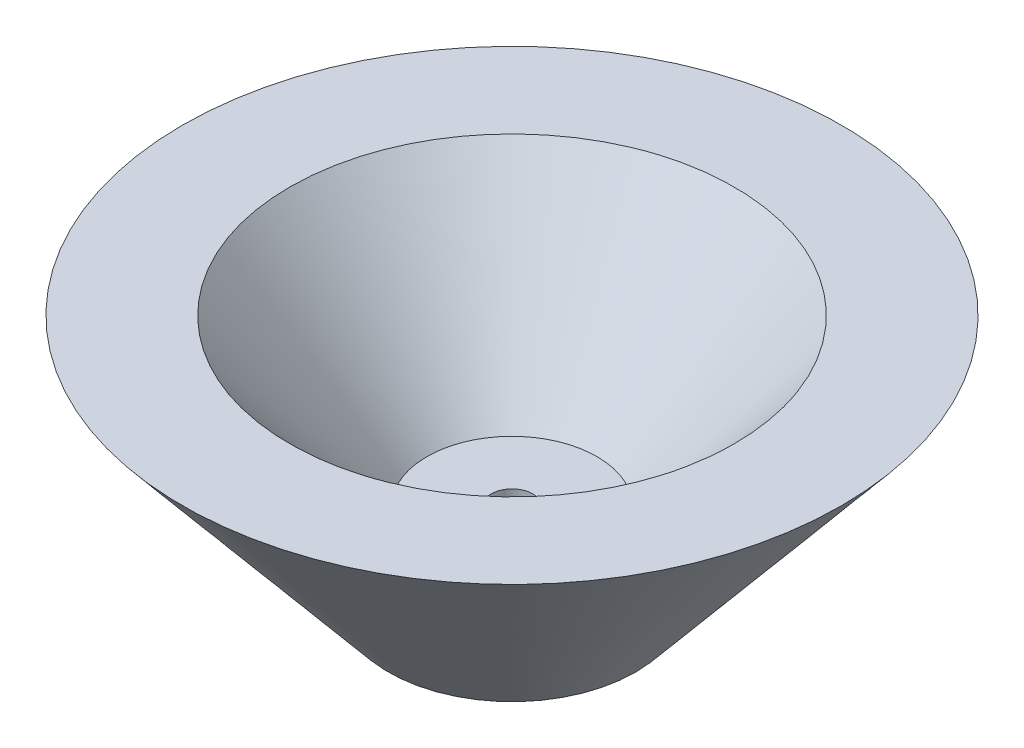
ISO-10303-21;
HEADER;
FILE_DESCRIPTION(('STEP AP214'),'2;1');
FILE_NAME('part.step','',(''),(''),'','','');
FILE_SCHEMA(('AUTOMOTIVE_DESIGN { 1 0 10303 214 1 1 1 1 }'));
ENDSEC;
DATA;
#1=APPLICATION_CONTEXT('core data for automotive mechanical design processes');
#2=APPLICATION_PROTOCOL_DEFINITION('international standard','automotive_design',2000,#1);
#3=PRODUCT_CONTEXT('',#1,'mechanical');
#4=PRODUCT('Part','Part','',(#3));
#5=PRODUCT_RELATED_PRODUCT_CATEGORY('part','',(#4));
#6=PRODUCT_DEFINITION_FORMATION('','',#4);
#7=PRODUCT_DEFINITION_CONTEXT('part definition',#1,'design');
#8=PRODUCT_DEFINITION('design','',#6,#7);
#9=PRODUCT_DEFINITION_SHAPE('','',#8);
#10=(LENGTH_UNIT() NAMED_UNIT(*) SI_UNIT(.MILLI.,.METRE.));
#11=(NAMED_UNIT(*) PLANE_ANGLE_UNIT() SI_UNIT($,.RADIAN.));
#12=(NAMED_UNIT(*) SI_UNIT($,.STERADIAN.) SOLID_ANGLE_UNIT());
#13=UNCERTAINTY_MEASURE_WITH_UNIT(LENGTH_MEASURE(1.E-05),#10,'distance_accuracy_value','');
#14=(GEOMETRIC_REPRESENTATION_CONTEXT(3) GLOBAL_UNCERTAINTY_ASSIGNED_CONTEXT((#13)) GLOBAL_UNIT_ASSIGNED_CONTEXT((#10,
#11,#12)) REPRESENTATION_CONTEXT('',''));
#15=CARTESIAN_POINT('',(0.,0.,0.));
#16=DIRECTION('',(0.,0.,1.));
#17=DIRECTION('',(1.,0.,0.));
#18=AXIS2_PLACEMENT_3D('',#15,#16,#17);
#19=CARTESIAN_POINT('',(0.,0.,0.));
#20=DIRECTION('',(0.,1.,0.));
#21=DIRECTION('',(0.,0.,1.));
#22=AXIS2_PLACEMENT_3D('',#19,#20,#21);
#23=PLANE('',#22);
#24=CARTESIAN_POINT('',(0.,0.,0.));
#25=DIRECTION('',(0.,1.,0.));
#26=DIRECTION('',(0.,0.,1.));
#27=AXIS2_PLACEMENT_3D('',#24,#25,#26);
#28=CIRCLE('',#27,2.5);
#29=CARTESIAN_POINT('',(0.,0.,2.5));
#30=VERTEX_POINT('',#29);
#31=EDGE_CURVE('E154',#30,#30,#28,.T.);
#32=ORIENTED_EDGE('',*,*,#31,.T.);
#33=EDGE_LOOP('',(#32));
#34=FACE_BOUND('',#33,.T.);
#35=CARTESIAN_POINT('',(0.,0.,0.));
#36=DIRECTION('',(0.,1.,0.));
#37=DIRECTION('',(0.,0.,1.));
#38=AXIS2_PLACEMENT_3D('',#35,#36,#37);
#39=CIRCLE('',#38,15.);
#40=CARTESIAN_POINT('',(15.,0.,0.));
#41=VERTEX_POINT('',#40);
#42=EDGE_CURVE('E12',#41,#41,#39,.T.);
#43=ORIENTED_EDGE('',*,*,#42,.F.);
#44=EDGE_LOOP('',(#43));
#45=FACE_BOUND('',#44,.T.);
#46=ADVANCED_FACE('F59',(#34,#45),#23,.F.);
#47=CARTESIAN_POINT('',(0.,30.,0.));
#48=DIRECTION('',(0.,1.,0.));
#49=DIRECTION('',(0.,0.,1.));
#50=AXIS2_PLACEMENT_3D('',#47,#48,#49);
#51=PLANE('',#50);
#52=CARTESIAN_POINT('',(0.,30.,-26.9829172068223));
#53=CARTESIAN_POINT('',(-0.780398825909655,30.,-26.9829223492156));
#54=CARTESIAN_POINT('',(-1.56073973750513,30.,-26.9498586144388));
#55=CARTESIAN_POINT('',(-3.11593630014212,30.,-26.8165341658903));
#56=CARTESIAN_POINT('',(-3.89079048214834,30.,-26.716256095873));
#57=CARTESIAN_POINT('',(-5.42945701852632,30.,-26.4483598528932));
#58=CARTESIAN_POINT('',(-6.19325932773842,30.,-26.2806839713188));
#59=CARTESIAN_POINT('',(-7.70316741900822,30.,-25.8790008176145));
#60=CARTESIAN_POINT('',(-8.44927458037557,30.,-25.6449987340477));
#61=CARTESIAN_POINT('',(-9.89595977565913,30.,-25.1205509906791));
#62=CARTESIAN_POINT('',(-10.5972322717818,30.,-24.832018195185));
#63=CARTESIAN_POINT('',(-11.9728305858836,30.,-24.1966234706895));
#64=CARTESIAN_POINT('',(-12.6471564626082,30.,-23.849761668858));
#65=CARTESIAN_POINT('',(-13.9641952149002,30.,-23.1004884164148));
#66=CARTESIAN_POINT('',(-14.606907985689,30.,-22.6980767817056));
#67=CARTESIAN_POINT('',(-15.8563564055711,30.,-21.8408230590299));
#68=CARTESIAN_POINT('',(-16.4630918539285,30.,-21.3859806785673));
#69=CARTESIAN_POINT('',(-17.6363984420286,30.,-20.4273103324598));
#70=CARTESIAN_POINT('',(-18.2029750330901,30.,-19.9234890375067));
#71=CARTESIAN_POINT('',(-19.2921825998457,30.,-18.8703963847273));
#72=CARTESIAN_POINT('',(-19.8148136270073,30.,-18.3211250801318));
#73=CARTESIAN_POINT('',(-20.8124080498688,30.,-17.1809821258604));
#74=CARTESIAN_POINT('',(-21.2873767748719,30.,-16.5901151397546));
#75=CARTESIAN_POINT('',(-22.1862488674157,30.,-15.3707312058554));
#76=CARTESIAN_POINT('',(-22.610152195603,30.,-14.7422142290475));
#77=CARTESIAN_POINT('',(-23.4074145378233,30.,-13.4456797932758));
#78=CARTESIAN_POINT('',(-23.7802582633012,30.,-12.7773452823593));
#79=CARTESIAN_POINT('',(-24.4676112262846,30.,-11.4113053874127));
#80=CARTESIAN_POINT('',(-24.7821196830254,30.,-10.7135996104281));
#81=CARTESIAN_POINT('',(-25.350212361059,30.,-9.29380153236564));
#82=CARTESIAN_POINT('',(-25.603796986774,30.,-8.57170939320472));
#83=CARTESIAN_POINT('',(-26.0480214683453,30.,-7.10847739021179));
#84=CARTESIAN_POINT('',(-26.2386642989231,30.,-6.36733842834536));
#85=CARTESIAN_POINT('',(-26.5533243333435,30.,-4.88280039534374));
#86=CARTESIAN_POINT('',(-26.6783151794666,30.,-4.13960894519706));
#87=CARTESIAN_POINT('',(-26.8188114957262,30.,-3.01912233076053));
#88=CARTESIAN_POINT('',(-26.8578140311056,30.,-2.64462601791168));
#89=CARTESIAN_POINT('',(-26.9202104229966,30.,-1.89430884850001));
#90=CARTESIAN_POINT('',(-26.9436041811845,30.,-1.51848798360849));
#91=CARTESIAN_POINT('',(-26.9748671166619,30.,-0.766164810972904));
#92=CARTESIAN_POINT('',(-26.9827344263657,30.,-0.389662426703873));
#93=CARTESIAN_POINT('',(-26.9830937303915,30.,0.363349268597036));
#94=CARTESIAN_POINT('',(-26.975585736453,30.,0.739858579623406));
#95=CARTESIAN_POINT('',(-26.9450438256533,30.,1.49224661949661));
#96=CARTESIAN_POINT('',(-26.9220103061162,30.,1.86812536423391));
#97=CARTESIAN_POINT('',(-26.860332872793,30.,2.61857364184882));
#98=CARTESIAN_POINT('',(-26.8216890014141,30.,2.99314317828024));
#99=CARTESIAN_POINT('',(-26.680877040275,30.,4.12501310864206));
#100=CARTESIAN_POINT('',(-26.5542644459797,30.,4.87943213859526));
#101=CARTESIAN_POINT('',(-26.2369042093327,30.,6.37456379148723));
#102=CARTESIAN_POINT('',(-26.0461560965451,30.,7.11527631384632));
#103=CARTESIAN_POINT('',(-25.6018647020952,30.,8.57741410689666));
#104=CARTESIAN_POINT('',(-25.3483397689536,30.,9.29884494513058));
#105=CARTESIAN_POINT('',(-24.7804729866827,30.,10.7173494268769));
#106=CARTESIAN_POINT('',(-24.466131031462,30.,11.4144230278972));
#107=CARTESIAN_POINT('',(-23.7845393107343,30.,12.7686633254565));
#108=CARTESIAN_POINT('',(-23.4181850609602,30.,13.4262810848909));
#109=CARTESIAN_POINT('',(-22.6318996097265,30.,14.7086464622493));
#110=CARTESIAN_POINT('',(-22.2119691069044,30.,15.3333945086462));
#111=CARTESIAN_POINT('',(-21.3215257880208,30.,16.5460765387337));
#112=CARTESIAN_POINT('',(-20.8509948292352,30.,17.1339971976475));
#113=CARTESIAN_POINT('',(-19.8628582407092,30.,18.2688579517712));
#114=CARTESIAN_POINT('',(-19.34525186935,30.,18.8157974011216));
#115=CARTESIAN_POINT('',(-18.25951171441,30.,19.871819978317));
#116=CARTESIAN_POINT('',(-17.6908068504556,30.,20.3803161510284));
#117=CARTESIAN_POINT('',(-16.5127064983646,30.,21.3477666652937));
#118=CARTESIAN_POINT('',(-15.9033108504236,30.,21.8067208122633));
#119=CARTESIAN_POINT('',(-14.6482292031252,30.,22.6714840992252));
#120=CARTESIAN_POINT('',(-14.0025565193601,30.,23.0773125593641));
#121=CARTESIAN_POINT('',(-12.6791551335234,30.,23.8328391391438));
#122=CARTESIAN_POINT('',(-12.0014264581868,30.,24.1825373055968));
#123=CARTESIAN_POINT('',(-10.6190935406679,30.,24.8227662427522));
#124=CARTESIAN_POINT('',(-9.91450670956436,30.,25.1133345957822));
#125=CARTESIAN_POINT('',(-8.48309328021703,30.,25.6332213272784));
#126=CARTESIAN_POINT('',(-7.7562672053061,30.,25.8625411458086));
#127=CARTESIAN_POINT('',(-6.28546771643838,30.,26.2582680471186));
#128=CARTESIAN_POINT('',(-5.541488928969,30.,26.424655122536));
#129=CARTESIAN_POINT('',(-4.04195345102691,30.,26.6934562597026));
#130=CARTESIAN_POINT('',(-3.28639646802886,30.,26.7958687023811));
#131=CARTESIAN_POINT('',(-2.15337045524962,30.,26.9010404468998));
#132=CARTESIAN_POINT('',(-1.77799197102523,30.,26.9280034466844));
#133=CARTESIAN_POINT('',(-1.02641654335677,30.,26.9663935996167));
#134=CARTESIAN_POINT('',(-0.650219593897431,30.,26.9778206381946));
#135=CARTESIAN_POINT('',(0.102325530953517,30.,26.9852985936104));
#136=CARTESIAN_POINT('',(0.478673706149953,30.,26.9813495302291));
#137=CARTESIAN_POINT('',(1.23086575153609,30.,26.9579948875457));
#138=CARTESIAN_POINT('',(1.60670962546063,30.,26.9385894233532));
#139=CARTESIAN_POINT('',(2.73238217019635,30.,26.8569849981424));
#140=CARTESIAN_POINT('',(3.48066332418591,30.,26.7714013055645));
#141=CARTESIAN_POINT('',(4.96728288879418,30.,26.5377104357115));
#142=CARTESIAN_POINT('',(5.70562166953427,30.,26.3896055925671));
#143=CARTESIAN_POINT('',(7.17784665581685,30.,26.028968420202));
#144=CARTESIAN_POINT('',(7.9115112354395,30.,25.8155287911601));
#145=CARTESIAN_POINT('',(9.35787257315449,30.,25.3265642705419));
#146=CARTESIAN_POINT('',(10.0705684186308,30.,25.0510366812354));
#147=CARTESIAN_POINT('',(11.4698856532878,30.,24.4400994393295));
#148=CARTESIAN_POINT('',(12.1565046280889,30.,24.1046842582291));
#149=CARTESIAN_POINT('',(13.4987415441763,30.,23.3767335431929));
#150=CARTESIAN_POINT('',(14.15435995055,30.,22.9841988665557));
#151=CARTESIAN_POINT('',(15.4217915347714,30.,22.1505717563509));
#152=CARTESIAN_POINT('',(16.0340623677882,30.,21.7101746893976));
#153=CARTESIAN_POINT('',(17.2198939291106,30.,20.7800421958399));
#154=CARTESIAN_POINT('',(17.7934549088222,30.,20.2903070897189));
#155=CARTESIAN_POINT('',(18.8980704140634,30.,19.2649200210071));
#156=CARTESIAN_POINT('',(19.4291199972862,30.,18.7292627345255));
#157=CARTESIAN_POINT('',(20.4449836347146,30.,17.6157566515675));
#158=CARTESIAN_POINT('',(20.9297971907813,30.,17.0379074006406));
#159=CARTESIAN_POINT('',(21.8565814104182,30.,15.8350003308145));
#160=CARTESIAN_POINT('',(22.2978059222353,30.,15.2093673092391));
#161=CARTESIAN_POINT('',(23.1256675901596,30.,13.9229553064759));
#162=CARTESIAN_POINT('',(23.5123042493958,30.,13.262176005454));
#163=CARTESIAN_POINT('',(24.2277792839944,30.,11.910283944266));
#164=CARTESIAN_POINT('',(24.5566353235987,30.,11.2191805355779));
#165=CARTESIAN_POINT('',(25.1539898968212,30.,9.81135958929592));
#166=CARTESIAN_POINT('',(25.422489527588,30.,9.09464251757736));
#167=CARTESIAN_POINT('',(25.8944838946303,30.,7.64845857473161));
#168=CARTESIAN_POINT('',(26.0986305179277,30.,6.91920409736418));
#169=CARTESIAN_POINT('',(26.4442914831349,30.,5.44591501718862));
#170=CARTESIAN_POINT('',(26.5858070671097,30.,4.70188070779193));
#171=CARTESIAN_POINT('',(26.7506475340682,30.,3.57894370747151));
#172=CARTESIAN_POINT('',(26.7976957731823,30.,3.2033715340538));
#173=CARTESIAN_POINT('',(26.8759963494079,30.,2.4505587735606));
#174=CARTESIAN_POINT('',(26.9072486738124,30.,2.07331818514319));
#175=CARTESIAN_POINT('',(26.9540039537179,30.,1.31784877461247));
#176=CARTESIAN_POINT('',(26.9695059800106,30.,0.939619895513321));
#177=CARTESIAN_POINT('',(26.9849207569893,30.,0.182843975350685));
#178=CARTESIAN_POINT('',(26.9848334052,30.,-0.195703067787864));
#179=CARTESIAN_POINT('',(26.9690395770501,30.,-0.953652637047121));
#180=CARTESIAN_POINT('',(26.953284732682,30.,-1.33305418214078));
#181=CARTESIAN_POINT('',(26.9059324227233,30.,-2.09083981969276));
#182=CARTESIAN_POINT('',(26.874335091682,30.,-2.46922392076474));
#183=CARTESIAN_POINT('',(26.7556718565393,30.,-3.60180647044037));
#184=CARTESIAN_POINT('',(26.6447302423316,30.,-4.35365587196606));
#185=CARTESIAN_POINT('',(26.3594235830758,30.,-5.84480318096032));
#186=CARTESIAN_POINT('',(26.1850851757385,30.,-6.58410622373301));
#187=CARTESIAN_POINT('',(25.7740323986173,30.,-8.0452173570321));
#188=CARTESIAN_POINT('',(25.537316176103,30.,-8.76702492721682));
#189=CARTESIAN_POINT('',(25.0043191972978,30.,-10.185201600752));
#190=CARTESIAN_POINT('',(24.7082647668522,30.,-10.8816558271227));
#191=CARTESIAN_POINT('',(24.0584179322441,30.,-12.2470730766779));
#192=CARTESIAN_POINT('',(23.7046258388554,30.,-12.9160362478092));
#193=CARTESIAN_POINT('',(22.9419989928128,30.,-14.2220816422295));
#194=CARTESIAN_POINT('',(22.5331472305601,30.,-14.8591539296987));
#195=CARTESIAN_POINT('',(21.6636252004358,30.,-16.096892510076));
#196=CARTESIAN_POINT('',(21.2029545443726,30.,-16.6975585302015));
#197=CARTESIAN_POINT('',(20.2321765030464,30.,-17.8596383912032));
#198=CARTESIAN_POINT('',(19.7219682729045,30.,-18.4209679804541));
#199=CARTESIAN_POINT('',(18.6565397828396,30.,-19.4991495758412));
#200=CARTESIAN_POINT('',(18.1013193836933,30.,-20.0160014443969));
#201=CARTESIAN_POINT('',(16.949592065794,30.,-21.0016607870275));
#202=CARTESIAN_POINT('',(16.3530783975307,30.,-21.4704603755982));
#203=CARTESIAN_POINT('',(15.1228992491983,30.,-22.3564681971045));
#204=CARTESIAN_POINT('',(14.4892342590662,30.,-22.7736771101721));
#205=CARTESIAN_POINT('',(13.183085795174,30.,-23.5568793253317));
#206=CARTESIAN_POINT('',(12.5103001587714,30.,-23.9223690196072));
#207=CARTESIAN_POINT('',(11.1359315990469,30.,-24.5946113095181));
#208=CARTESIAN_POINT('',(10.4343466229349,30.,-24.9013597092693));
#209=CARTESIAN_POINT('',(9.00839093528431,30.,-25.45320071788));
#210=CARTESIAN_POINT('',(8.28405176585479,30.,-25.6983747765788));
#211=CARTESIAN_POINT('',(6.81726153320031,30.,-26.1256142262459));
#212=CARTESIAN_POINT('',(6.07481586167347,30.,-26.3076981642101));
#213=CARTESIAN_POINT('',(4.45003591238344,30.,-26.6331127845848));
#214=CARTESIAN_POINT('',(3.5653167586842,30.,-26.7646474345677));
#215=CARTESIAN_POINT('',(1.78704129715701,30.,-26.9395584840229));
#216=CARTESIAN_POINT('',(0.893482691306255,30.,-26.9829113192693));
#217=CARTESIAN_POINT('',(0.,30.,-26.9829172068223));
#218=B_SPLINE_CURVE_WITH_KNOTS('',3,(#52,#53,#54,#55,#56,#57,#58,#59,#60,#61,#62,#63,#64,#65,
#66,#67,#68,#69,#70,#71,#72,#73,#74,#75,#76,#77,#78,#79,#80,#81,#82,#83,#84,#85,#86,#87,#88,#89,
#90,#91,#92,#93,#94,#95,#96,#97,#98,#99,#100,#101,#102,#103,#104,#105,#106,#107,#108,#109,#110,
#111,#112,#113,#114,#115,#116,#117,#118,#119,#120,#121,#122,#123,#124,#125,#126,#127,#128,#129,
#130,#131,#132,#133,#134,#135,#136,#137,#138,#139,#140,#141,#142,#143,#144,#145,#146,#147,#148,
#149,#150,#151,#152,#153,#154,#155,#156,#157,#158,#159,#160,#161,#162,#163,#164,#165,#166,#167,
#168,#169,#170,#171,#172,#173,#174,#175,#176,#177,#178,#179,#180,#181,#182,#183,#184,#185,#186,
#187,#188,#189,#190,#191,#192,#193,#194,#195,#196,#197,#198,#199,#200,#201,#202,#203,#204,#205,
#206,#207,#208,#209,#210,#211,#212,#213,#214,#215,#216,#217),.UNSPECIFIED.,.T.,.F.,(4,2,2,2,2,2,
2,2,2,2,2,2,2,2,2,2,2,2,2,2,2,2,2,2,2,2,2,2,2,2,2,2,2,2,2,2,2,2,2,2,2,2,2,2,2,2,2,2,2,2,2,2,2,2,
2,2,2,2,2,2,2,2,2,2,2,2,2,2,2,2,2,2,2,2,2,2,2,2,2,2,2,2,4),(0.,2.34036270305166,
4.68132997306671,7.02430595417589,9.36709869962466,11.6393101299821,13.9115166064923,
16.183730613497,18.4559572971487,20.7278749468926,22.9997899358134,25.2714506095699,
27.5431130339658,29.8362344885753,32.1293866323236,34.4225235533376,36.7155520818276,
38.9735388467245,40.1028367392201,41.232141745387,42.3615825807685,43.4910225537897,
44.6204336236482,45.7498416253573,48.0417067065714,50.3335885990486,52.6248014052908,
54.9160182084408,57.1717239298128,59.4274002396527,61.6838880328351,63.9404113805375,
66.2263730504259,68.5123436984727,70.7974806873878,73.0826157705094,75.3662938764023,
77.6499182841564,79.934268084958,82.2186756957663,83.347449339072,84.4762313064613,
85.6050118217196,86.733783930599,88.9903962794823,91.2469243886763,93.5363313050657,
95.8258377156796,98.1155555906205,100.405239103054,102.665243353183,104.925232924017,
107.185484857181,109.445761139147,111.739721818379,114.033703376422,116.326982411393,
118.620219756153,120.889419140029,123.158573520352,124.29382334312,125.42907407914,
126.564391786794,127.699716957338,128.838557969447,129.977389309609,132.25439182536,
134.530438706286,136.806553197416,139.074145988152,141.34172657394,143.610009297941,
145.878309015492,148.151327251247,150.424352517756,152.697750198449,154.971117905211,
157.26528905893,159.559624023961,161.850907891374,164.141517603156,166.820295346548,
169.499788827485),.UNSPECIFIED.);
#219=CARTESIAN_POINT('',(26.9829172069173,30.0000000001141,1.45120268177612E-10));
#220=VERTEX_POINT('',#219);
#221=EDGE_CURVE('E148',#220,#220,#218,.T.);
#222=ORIENTED_EDGE('',*,*,#221,.F.);
#223=EDGE_LOOP('',(#222));
#224=FACE_BOUND('',#223,.T.);
#225=CARTESIAN_POINT('',(0.,30.,0.));
#226=DIRECTION('',(0.,1.,0.));
#227=DIRECTION('',(0.,0.,1.));
#228=AXIS2_PLACEMENT_3D('',#225,#226,#227);
#229=CIRCLE('',#228,40.);
#230=CARTESIAN_POINT('',(40.,30.,0.));
#231=VERTEX_POINT('',#230);
#232=EDGE_CURVE('E68',#231,#231,#229,.T.);
#233=ORIENTED_EDGE('',*,*,#232,.T.);
#234=EDGE_LOOP('',(#233));
#235=FACE_BOUND('',#234,.T.);
#236=ADVANCED_FACE('F93',(#224,#235),#51,.T.);
#237=CARTESIAN_POINT('',(40.,30.,0.));
#238=CARTESIAN_POINT('',(31.6666666666667,20.,0.));
#239=CARTESIAN_POINT('',(23.3333333333333,10.,0.));
#240=CARTESIAN_POINT('',(15.,0.,0.));
#241=CARTESIAN_POINT('',(40.,30.,1.1038300198462));
#242=CARTESIAN_POINT('',(31.6666666666667,20.,0.873865432378244));
#243=CARTESIAN_POINT('',(23.3333333333333,10.,0.643900844910285));
#244=CARTESIAN_POINT('',(15.,0.,0.413936257442326));
#245=CARTESIAN_POINT('',(39.9103830019846,30.,3.29072405556936));
#246=CARTESIAN_POINT('',(31.5957198765711,20.,2.60515654399241));
#247=CARTESIAN_POINT('',(23.2810567511577,10.,1.91958903241546));
#248=CARTESIAN_POINT('',(14.9663936257442,0.,1.23402152083851));
#249=CARTESIAN_POINT('',(39.5174341600223,30.,6.49843944813946));
#250=CARTESIAN_POINT('',(31.2846353766843,20.,5.14459789644374));
#251=CARTESIAN_POINT('',(23.0518365933464,10.,3.79075634474802));
#252=CARTESIAN_POINT('',(14.8190378100084,0.,2.4369147930523));
#253=CARTESIAN_POINT('',(38.8762896222277,30.,9.62320153058801));
#254=CARTESIAN_POINT('',(30.777062617597,20.,7.61836787838217));
#255=CARTESIAN_POINT('',(22.6778356129662,10.,5.61353422617634));
#256=CARTESIAN_POINT('',(14.5786086083354,0.,3.6087005739705));
#257=CARTESIAN_POINT('',(33.6022141151079,30.,27.8120882699083));
#258=CARTESIAN_POINT('',(26.6017528411271,20.,22.0179032136774));
#259=CARTESIAN_POINT('',(19.6012915671463,10.,16.2237181574465));
#260=CARTESIAN_POINT('',(12.6008302931655,0.,10.4295331012156));
#261=CARTESIAN_POINT('',(17.6612803175392,30.,40.));
#262=CARTESIAN_POINT('',(13.9818469180519,20.,31.6666666666667));
#263=CARTESIAN_POINT('',(10.3024135185645,10.,23.3333333333333));
#264=CARTESIAN_POINT('',(6.6229801190772,0.,15.));
#265=CARTESIAN_POINT('',(-22.076600396924,30.,40.));
#266=CARTESIAN_POINT('',(-17.4773086475648,20.,31.6666666666667));
#267=CARTESIAN_POINT('',(-12.8780168982057,10.,23.3333333333333));
#268=CARTESIAN_POINT('',(-8.2787251488465,0.,15.));
#269=CARTESIAN_POINT('',(-40.,30.,22.076600396924));
#270=CARTESIAN_POINT('',(-31.6666666666667,20.,17.4773086475648));
#271=CARTESIAN_POINT('',(-23.3333333333333,10.,12.8780168982057));
#272=CARTESIAN_POINT('',(-15.,0.,8.2787251488465));
#273=CARTESIAN_POINT('',(-40.,30.,-22.076600396924));
#274=CARTESIAN_POINT('',(-31.6666666666667,20.,-17.4773086475648));
#275=CARTESIAN_POINT('',(-23.3333333333333,10.,-12.8780168982057));
#276=CARTESIAN_POINT('',(-15.,0.,-8.2787251488465));
#277=CARTESIAN_POINT('',(-22.076600396924,30.,-40.));
#278=CARTESIAN_POINT('',(-17.4773086475648,20.,-31.6666666666667));
#279=CARTESIAN_POINT('',(-12.8780168982057,10.,-23.3333333333333));
#280=CARTESIAN_POINT('',(-8.2787251488465,0.,-15.));
#281=CARTESIAN_POINT('',(17.6612803175392,30.,-40.));
#282=CARTESIAN_POINT('',(13.9818469180519,20.,-31.6666666666667));
#283=CARTESIAN_POINT('',(10.3024135185645,10.,-23.3333333333333));
#284=CARTESIAN_POINT('',(6.6229801190772,0.,-15.));
#285=CARTESIAN_POINT('',(33.602214115108,30.,-27.8120882699083));
#286=CARTESIAN_POINT('',(26.6017528411271,20.,-22.0179032136774));
#287=CARTESIAN_POINT('',(19.6012915671463,10.,-16.2237181574465));
#288=CARTESIAN_POINT('',(12.6008302931655,0.,-10.4295331012156));
#289=CARTESIAN_POINT('',(38.8762896222277,30.,-9.62320153058799));
#290=CARTESIAN_POINT('',(30.777062617597,20.,-7.61836787838216));
#291=CARTESIAN_POINT('',(22.6778356129662,10.,-5.61353422617633));
#292=CARTESIAN_POINT('',(14.5786086083354,0.,-3.6087005739705));
#293=CARTESIAN_POINT('',(39.5174341600223,30.,-6.49843944813945));
#294=CARTESIAN_POINT('',(31.2846353766843,20.,-5.14459789644373));
#295=CARTESIAN_POINT('',(23.0518365933464,10.,-3.79075634474801));
#296=CARTESIAN_POINT('',(14.8190378100084,0.,-2.43691479305229));
#297=CARTESIAN_POINT('',(39.9103830019846,30.,-3.29072405556935));
#298=CARTESIAN_POINT('',(31.5957198765711,20.,-2.6051565439924));
#299=CARTESIAN_POINT('',(23.2810567511577,10.,-1.91958903241545));
#300=CARTESIAN_POINT('',(14.9663936257442,0.,-1.23402152083851));
#301=CARTESIAN_POINT('',(40.,30.,-1.10383001984619));
#302=CARTESIAN_POINT('',(31.6666666666667,20.,-0.873865432378233));
#303=CARTESIAN_POINT('',(23.3333333333333,10.,-0.643900844910277));
#304=CARTESIAN_POINT('',(15.,0.,-0.413936257442321));
#305=CARTESIAN_POINT('',(40.,30.,0.));
#306=CARTESIAN_POINT('',(31.6666666666667,20.,0.));
#307=CARTESIAN_POINT('',(23.3333333333333,10.,0.));
#308=CARTESIAN_POINT('',(15.,0.,0.));
#309=B_SPLINE_SURFACE_WITH_KNOTS('',3,3,((#237,#238,#239,#240),(#241,#242,#243,#244),(#245,#246,
#247,#248),(#249,#250,#251,#252),(#253,#254,#255,#256),(#257,#258,#259,#260),(#261,#262,#263,
#264),(#265,#266,#267,#268),(#269,#270,#271,#272),(#273,#274,#275,#276),(#277,#278,#279,#280),
(#281,#282,#283,#284),(#285,#286,#287,#288),(#289,#290,#291,#292),(#293,#294,#295,#296),(#297,
#298,#299,#300),(#301,#302,#303,#304),(#305,#306,#307,#308)),.UNSPECIFIED.,.T.,.F.,.F.,(4,1,1,1,
1,2,2,2,1,1,1,1,4),(4,4),(0.,0.0125,0.0249999999999999,0.0375000000000001,0.05,0.25,0.5,0.75,
0.95,0.9625,0.975,0.9875,1.),(0.,1.),.UNSPECIFIED.);
#310=CARTESIAN_POINT('',(40.,30.,0.));
#311=CARTESIAN_POINT('',(39.7395833333333,29.6875,0.));
#312=CARTESIAN_POINT('',(39.4791666666667,29.375,0.));
#313=CARTESIAN_POINT('',(38.9583333333333,28.75,0.));
#314=CARTESIAN_POINT('',(38.6979166666667,28.4375,0.));
#315=CARTESIAN_POINT('',(38.1770833333333,27.8125,0.));
#316=CARTESIAN_POINT('',(37.9166666666667,27.5,0.));
#317=CARTESIAN_POINT('',(37.3958333333333,26.875,0.));
#318=CARTESIAN_POINT('',(37.1354166666667,26.5625,0.));
#319=CARTESIAN_POINT('',(36.6145833333333,25.9375,0.));
#320=CARTESIAN_POINT('',(36.3541666666667,25.625,0.));
#321=CARTESIAN_POINT('',(35.8333333333333,25.,0.));
#322=CARTESIAN_POINT('',(35.5729166666667,24.6875,0.));
#323=CARTESIAN_POINT('',(35.0520833333333,24.0625,0.));
#324=CARTESIAN_POINT('',(34.7916666666667,23.75,0.));
#325=CARTESIAN_POINT('',(34.2708333333333,23.125,0.));
#326=CARTESIAN_POINT('',(34.0104166666667,22.8125,0.));
#327=CARTESIAN_POINT('',(33.4895833333333,22.1875,0.));
#328=CARTESIAN_POINT('',(33.2291666666667,21.875,0.));
#329=CARTESIAN_POINT('',(32.7083333333333,21.25,0.));
#330=CARTESIAN_POINT('',(32.4479166666667,20.9375,0.));
#331=CARTESIAN_POINT('',(31.9270833333333,20.3125,0.));
#332=CARTESIAN_POINT('',(31.6666666666667,20.,0.));
#333=CARTESIAN_POINT('',(31.1458333333333,19.375,0.));
#334=CARTESIAN_POINT('',(30.8854166666667,19.0625,0.));
#335=CARTESIAN_POINT('',(30.3645833333333,18.4375,0.));
#336=CARTESIAN_POINT('',(30.1041666666667,18.125,0.));
#337=CARTESIAN_POINT('',(29.5833333333333,17.5,0.));
#338=CARTESIAN_POINT('',(29.3229166666667,17.1875,0.));
#339=CARTESIAN_POINT('',(28.8020833333333,16.5625,0.));
#340=CARTESIAN_POINT('',(28.5416666666667,16.25,0.));
#341=CARTESIAN_POINT('',(28.0208333333333,15.625,0.));
#342=CARTESIAN_POINT('',(27.7604166666667,15.3125,0.));
#343=CARTESIAN_POINT('',(27.2395833333333,14.6875,0.));
#344=CARTESIAN_POINT('',(26.9791666666667,14.375,0.));
#345=CARTESIAN_POINT('',(26.4583333333333,13.75,0.));
#346=CARTESIAN_POINT('',(26.1979166666667,13.4375,0.));
#347=CARTESIAN_POINT('',(25.6770833333333,12.8125,0.));
#348=CARTESIAN_POINT('',(25.4166666666667,12.5,0.));
#349=CARTESIAN_POINT('',(24.8958333333333,11.875,0.));
#350=CARTESIAN_POINT('',(24.6354166666667,11.5625,0.));
#351=CARTESIAN_POINT('',(24.1145833333333,10.9375,0.));
#352=CARTESIAN_POINT('',(23.8541666666667,10.625,0.));
#353=CARTESIAN_POINT('',(23.3333333333333,10.,0.));
#354=CARTESIAN_POINT('',(23.0729166666667,9.6875,0.));
#355=CARTESIAN_POINT('',(22.5520833333333,9.0625,0.));
#356=CARTESIAN_POINT('',(22.2916666666667,8.75,0.));
#357=CARTESIAN_POINT('',(21.7708333333333,8.125,0.));
#358=CARTESIAN_POINT('',(21.5104166666667,7.8125,0.));
#359=CARTESIAN_POINT('',(20.9895833333333,7.1875,0.));
#360=CARTESIAN_POINT('',(20.7291666666667,6.875,0.));
#361=CARTESIAN_POINT('',(20.2083333333333,6.25,0.));
#362=CARTESIAN_POINT('',(19.9479166666667,5.9375,0.));
#363=CARTESIAN_POINT('',(19.4270833333333,5.3125,0.));
#364=CARTESIAN_POINT('',(19.1666666666667,5.,0.));
#365=CARTESIAN_POINT('',(18.6458333333333,4.375,0.));
#366=CARTESIAN_POINT('',(18.3854166666667,4.0625,0.));
#367=CARTESIAN_POINT('',(17.8645833333333,3.4375,0.));
#368=CARTESIAN_POINT('',(17.6041666666667,3.125,0.));
#369=CARTESIAN_POINT('',(17.0833333333333,2.5,0.));
#370=CARTESIAN_POINT('',(16.8229166666667,2.1875,0.));
#371=CARTESIAN_POINT('',(16.3020833333333,1.5625,0.));
#372=CARTESIAN_POINT('',(16.0416666666667,1.25,0.));
#373=CARTESIAN_POINT('',(15.5208333333333,0.625,0.));
#374=CARTESIAN_POINT('',(15.2604166666667,0.3125,0.));
#375=CARTESIAN_POINT('',(15.,0.,0.));
#376=B_SPLINE_CURVE_WITH_KNOTS('',3,(#310,#311,#312,#313,#314,#315,#316,#317,#318,#319,#320,
#321,#322,#323,#324,#325,#326,#327,#328,#329,#330,#331,#332,#333,#334,#335,#336,#337,#338,#339,
#340,#341,#342,#343,#344,#345,#346,#347,#348,#349,#350,#351,#352,#353,#354,#355,#356,#357,#358,
#359,#360,#361,#362,#363,#364,#365,#366,#367,#368,#369,#370,#371,#372,#373,#374,#375),
.UNSPECIFIED.,.F.,.F.,(4,2,2,2,2,2,2,2,2,2,2,2,2,2,2,2,2,2,2,2,2,2,2,2,2,2,2,2,2,2,2,2,4),(0.,
1.22035151186041,2.44070302372083,3.66105453558125,4.88140604744165,6.10175755930207,
7.32210907116249,8.5424605830229,9.76281209488332,10.9831636067437,12.2035151186041,
13.4238666304646,14.644218142325,15.8645696541854,17.0849211660458,18.3052726779062,
19.5256241897666,20.745975701627,21.9663272134875,23.1866787253479,24.4070302372083,
25.6273817490687,26.8477332609291,28.0680847727895,29.28843628465,30.5087877965104,
31.7291393083708,32.9494908202312,34.1698423320916,35.390193843952,36.6105453558124,
37.8308968676729,39.0512483795333),.UNSPECIFIED.);
#377=EDGE_CURVE('BSEAM102',#231,#41,#376,.T.);
#378=ORIENTED_EDGE('',*,*,#232,.F.);
#379=ORIENTED_EDGE('',*,*,#42,.T.);
#380=ORIENTED_EDGE('',*,*,#377,.T.);
#381=ORIENTED_EDGE('',*,*,#377,.F.);
#382=EDGE_LOOP('',(#378,#380,#379,#381));
#383=FACE_BOUND('',#382,.T.);
#384=ADVANCED_FACE('F102',(#383),#309,.T.);
#385=CARTESIAN_POINT('',(0.,10.,0.));
#386=DIRECTION('',(0.,1.,0.));
#387=DIRECTION('',(0.,0.,1.));
#388=AXIS2_PLACEMENT_3D('',#385,#386,#387);
#389=PLANE('',#388);
#390=CARTESIAN_POINT('',(0.,10.,0.));
#391=DIRECTION('',(0.,1.,0.));
#392=DIRECTION('',(0.,0.,1.));
#393=AXIS2_PLACEMENT_3D('',#390,#391,#392);
#394=CIRCLE('',#393,2.5);
#395=CARTESIAN_POINT('',(0.,10.,2.5));
#396=VERTEX_POINT('',#395);
#397=EDGE_CURVE('E164',#396,#396,#394,.T.);
#398=ORIENTED_EDGE('',*,*,#397,.F.);
#399=EDGE_LOOP('',(#398));
#400=FACE_BOUND('',#399,.T.);
#401=CARTESIAN_POINT('',(-10.3162505401556,9.99999999999999,0.));
#402=CARTESIAN_POINT('',(-10.3162542056969,9.99999999999999,0.288733628404555));
#403=CARTESIAN_POINT('',(-10.3045183233077,10.,0.577431807533369));
#404=CARTESIAN_POINT('',(-10.257048453444,10.,1.15293804271122));
#405=CARTESIAN_POINT('',(-10.2213102038618,10.,1.43974575393394));
#406=CARTESIAN_POINT('',(-10.1256781906897,10.,2.00948222888788));
#407=CARTESIAN_POINT('',(-10.0657700559715,10.,2.29240858113928));
#408=CARTESIAN_POINT('',(-9.92207906646343,10.,2.85212487209072));
#409=CARTESIAN_POINT('',(-9.83829707946269,10.,3.12891503344068));
#410=CARTESIAN_POINT('',(-9.64748592934523,10.,3.67433055142761));
#411=CARTESIAN_POINT('',(-9.54045897871531,10.,3.94295668235594));
#412=CARTESIAN_POINT('',(-9.30403787279176,10.,4.47018022152834));
#413=CARTESIAN_POINT('',(-9.17464328969316,10.,4.72877743784282));
#414=CARTESIAN_POINT('',(-8.89455847674648,10.,5.23418343685927));
#415=CARTESIAN_POINT('',(-8.74386702569044,10.,5.48099154246178));
#416=CARTESIAN_POINT('',(-8.4223429737776,10.,5.96124343416506));
#417=CARTESIAN_POINT('',(-8.25150313979317,10.,6.19468237587839));
#418=CARTESIAN_POINT('',(-7.89089170656042,10.,6.64671508648849));
#419=CARTESIAN_POINT('',(-7.70110682299735,10.,6.86529825538258));
#420=CARTESIAN_POINT('',(-7.30406470447909,10.,7.28597411650941));
#421=CARTESIAN_POINT('',(-7.09680740330182,10.,7.48806674623579));
#422=CARTESIAN_POINT('',(-6.66623663353318,10.,7.87436314903581));
#423=CARTESIAN_POINT('',(-6.44292298342052,10.,8.05856671981356));
#424=CARTESIAN_POINT('',(-5.98180625495589,10.,8.40768352360557));
#425=CARTESIAN_POINT('',(-5.74400791961177,10.,8.57260302008897));
#426=CARTESIAN_POINT('',(-5.25196118281903,10.,8.88414555317648));
#427=CARTESIAN_POINT('',(-4.99752727693414,10.,9.03047584985261));
#428=CARTESIAN_POINT('',(-4.4770638899234,10.,9.30083373302166));
#429=CARTESIAN_POINT('',(-4.21103419103412,10.,9.4248609004481));
#430=CARTESIAN_POINT('',(-3.66929438128953,10.,9.64953114666975));
#431=CARTESIAN_POINT('',(-3.39358502230918,10.,9.75017603709552));
#432=CARTESIAN_POINT('',(-2.8345124602197,10.,9.92724992303693));
#433=CARTESIAN_POINT('',(-2.55114945668038,10.,10.0036795493086));
#434=CARTESIAN_POINT('',(-1.98469064768617,10.,10.1304943917034));
#435=CARTESIAN_POINT('',(-1.70170720674766,10.,10.1813788855369));
#436=CARTESIAN_POINT('',(-1.27485835396063,10.,10.2397982686115));
#437=CARTESIAN_POINT('',(-1.13216205655667,10.,10.2562877648087));
#438=CARTESIAN_POINT('',(-0.846188923533486,10.,10.2833291969865));
#439=CARTESIAN_POINT('',(-0.70291204615895,10.,10.293880697989));
#440=CARTESIAN_POINT('',(-0.416020216324626,10.,10.3090817447927));
#441=CARTESIAN_POINT('',(-0.27240520601177,10.,10.31373019396));
#442=CARTESIAN_POINT('',(0.0148832712033127,10.,10.3172147760516));
#443=CARTESIAN_POINT('',(0.158556737002378,10.,10.3160510139988));
#444=CARTESIAN_POINT('',(0.589317142637261,10.,10.3037693934229));
#445=CARTESIAN_POINT('',(0.876209157129933,10.,10.2838646499383));
#446=CARTESIAN_POINT('',(1.45277226358962,10.,10.2195851313622));
#447=CARTESIAN_POINT('',(1.7423916948817,10.,10.1747500083852));
#448=CARTESIAN_POINT('',(2.31671224222023,10.,10.0603326948005));
#449=CARTESIAN_POINT('',(2.60141339040719,10.,9.99075066597569));
#450=CARTESIAN_POINT('',(3.16361701005857,10.,9.8272999552374));
#451=CARTESIAN_POINT('',(3.44112261879835,10.,9.73344206045701));
#452=CARTESIAN_POINT('',(3.98702721833659,10.,9.52218115485182));
#453=CARTESIAN_POINT('',(4.25542602045842,10.,9.40477765655238));
#454=CARTESIAN_POINT('',(4.77586815149756,10.,9.15004075074756));
#455=CARTESIAN_POINT('',(5.02813243707239,10.,9.01315825183372));
#456=CARTESIAN_POINT('',(5.52038397866758,10.,8.71887430678449));
#457=CARTESIAN_POINT('',(5.76037146790781,10.,8.56147325063777));
#458=CARTESIAN_POINT('',(6.22662373309748,10.,8.22728105216212));
#459=CARTESIAN_POINT('',(6.4528814479706,10.,8.0504800617304));
#460=CARTESIAN_POINT('',(6.89006609103082,10.,7.67884175689712));
#461=CARTESIAN_POINT('',(7.10099279057419,10.,7.48400417359987));
#462=CARTESIAN_POINT('',(7.50953754943159,10.,7.07420052439761));
#463=CARTESIAN_POINT('',(7.70687007678334,10.,6.85894968753503));
#464=CARTESIAN_POINT('',(8.08272988607848,10.,6.41276635635658));
#465=CARTESIAN_POINT('',(8.2612650595742,10.,6.18184051027142));
#466=CARTESIAN_POINT('',(8.59823072882915,10.,5.70584629176835));
#467=CARTESIAN_POINT('',(8.75666658011165,10.,5.46078171208269));
#468=CARTESIAN_POINT('',(9.05221799119785,10.,4.95811164212894));
#469=CARTESIAN_POINT('',(9.18933357765754,10.,4.70050616754084));
#470=CARTESIAN_POINT('',(9.44117334574822,10.,4.17436084830368));
#471=CARTESIAN_POINT('',(9.55588286389646,10.,3.90581398113777));
#472=CARTESIAN_POINT('',(9.76181835900807,10.,3.3598680352516));
#473=CARTESIAN_POINT('',(9.85304499254887,10.,3.08246920427452));
#474=CARTESIAN_POINT('',(10.0113265595582,10.,2.52073810989));
#475=CARTESIAN_POINT('',(10.0783718236796,10.,2.23640312134944));
#476=CARTESIAN_POINT('',(10.1878571084813,10.,1.66304234221151));
#477=CARTESIAN_POINT('',(10.2302966454781,9.99999999999999,1.37401645951838));
#478=CARTESIAN_POINT('',(10.2900443784336,9.99999999999999,0.798440587308409));
#479=CARTESIAN_POINT('',(10.3077765491591,10.,0.511934874888931));
#480=CARTESIAN_POINT('',(10.3169122912852,10.,0.081879406936031));
#481=CARTESIAN_POINT('',(10.31704618915,10.,-0.0615374305964702));
#482=CARTESIAN_POINT('',(10.3115106775905,10.,-0.348261837393317));
#483=CARTESIAN_POINT('',(10.3058411793317,10.,-0.491569404951427));
#484=CARTESIAN_POINT('',(10.279991161997,10.,-0.920885827196975));
#485=CARTESIAN_POINT('',(10.2509719564902,10.,-1.20641675658872));
#486=CARTESIAN_POINT('',(10.1691450252252,10.,-1.77400385019074));
#487=CARTESIAN_POINT('',(10.1163387444689,10.,-2.05606022440196));
#488=CARTESIAN_POINT('',(9.98574216728275,10.,-2.62059200993257));
#489=CARTESIAN_POINT('',(9.90745050750825,10.,-2.90295184090357));
#490=CARTESIAN_POINT('',(9.72679028384012,10.,-3.45986389970696));
#491=CARTESIAN_POINT('',(9.62442105173165,10.,-3.7344159106151));
#492=CARTESIAN_POINT('',(9.39645494197656,10.,-4.27372501507879));
#493=CARTESIAN_POINT('',(9.27085607455638,10.,-4.53848126722902));
#494=CARTESIAN_POINT('',(8.99751787028802,10.,-5.056294760986));
#495=CARTESIAN_POINT('',(8.84977900738851,10.,-5.30935225287524));
#496=CARTESIAN_POINT('',(8.53639681065317,10.,-5.7973487649929));
#497=CARTESIAN_POINT('',(8.37114682512699,10.,-6.0325406208219));
#498=CARTESIAN_POINT('',(8.02171867634374,10.,-6.48853120888715));
#499=CARTESIAN_POINT('',(7.83753457672564,10.,-6.70932539138223));
#500=CARTESIAN_POINT('',(7.45159348224931,10.,-7.13499238676079));
#501=CARTESIAN_POINT('',(7.24983588994469,10.,-7.33986465789831));
#502=CARTESIAN_POINT('',(6.83012485132258,10.,-7.73229724561048));
#503=CARTESIAN_POINT('',(6.61217099736296,10.,-7.91985712618469));
#504=CARTESIAN_POINT('',(6.15681890339106,10.,-8.28004112096657));
#505=CARTESIAN_POINT('',(5.91911052966897,10.,-8.45227345592409));
#506=CARTESIAN_POINT('',(5.43002765757517,10.,-8.77590165870171));
#507=CARTESIAN_POINT('',(5.17865805360531,10.,-8.9273049211814));
#508=CARTESIAN_POINT('',(4.66397106116826,10.,-9.208058612146));
#509=CARTESIAN_POINT('',(4.40065683453965,10.,-9.33741483402697));
#510=CARTESIAN_POINT('',(3.863882016391,10.,-9.57300916071301));
#511=CARTESIAN_POINT('',(3.59042162838409,9.99999999999999,-9.6792477289221));
#512=CARTESIAN_POINT('',(3.03896215180012,9.99999999999999,-9.86647993759386));
#513=CARTESIAN_POINT('',(2.76106851712384,10.,-9.94778426301167));
#514=CARTESIAN_POINT('',(2.19937430600262,10.,-10.0864104646055));
#515=CARTESIAN_POINT('',(1.91557393778345,10.,-10.1437331846895));
#516=CARTESIAN_POINT('',(1.34399400811763,10.,-10.2341785653223));
#517=CARTESIAN_POINT('',(1.05621238706318,10.,-10.2672881833988));
#518=CARTESIAN_POINT('',(0.47889028932571,10.,-10.309459763051));
#519=CARTESIAN_POINT('',(0.189349686206091,10.,-10.318519974943));
#520=CARTESIAN_POINT('',(-0.389990613107634,10.,-10.3130367982472));
#521=CARTESIAN_POINT('',(-0.67978994582226,10.,-10.2984543472729));
#522=CARTESIAN_POINT('',(-1.25713334629242,10.,-10.245038104383));
#523=CARTESIAN_POINT('',(-1.54467764684209,10.,-10.2062068500264));
#524=CARTESIAN_POINT('',(-2.11526970142897,10.,-10.104276583264));
#525=CARTESIAN_POINT('',(-2.39831989961947,10.,-10.041191267707));
#526=CARTESIAN_POINT('',(-2.95800925286137,10.,-9.89106869641302));
#527=CARTESIAN_POINT('',(-3.23464816632501,10.,-9.80403053967942));
#528=CARTESIAN_POINT('',(-3.77895302548506,10.,-9.60686275041877));
#529=CARTESIAN_POINT('',(-4.0466355148201,10.,-9.49677876905739));
#530=CARTESIAN_POINT('',(-4.57170958987395,10.,-9.25433489820069));
#531=CARTESIAN_POINT('',(-4.82910119288674,10.,-9.12197504614223));
#532=CARTESIAN_POINT('',(-5.33189612601718,10.,-8.83604701700026));
#533=CARTESIAN_POINT('',(-5.57729662193877,10.,-8.68247385848959));
#534=CARTESIAN_POINT('',(-6.05449958984344,9.99999999999999,-8.35530373644021));
#535=CARTESIAN_POINT('',(-6.28629677942252,9.99999999999998,-8.18169907092131));
#536=CARTESIAN_POINT('',(-6.73466262999083,9.99999999999998,-7.81581285514563));
#537=CARTESIAN_POINT('',(-6.95123063849102,9.99999999999999,-7.62353050548936));
#538=CARTESIAN_POINT('',(-7.36776374073948,10.,-7.2215732427919));
#539=CARTESIAN_POINT('',(-7.56772129084155,10.,-7.01189051284109));
#540=CARTESIAN_POINT('',(-7.94955189451636,10.,-6.57661159700104));
#541=CARTESIAN_POINT('',(-8.1314227458675,10.,-6.35101347896972));
#542=CARTESIAN_POINT('',(-8.47563593178453,10.,-5.88553756858248));
#543=CARTESIAN_POINT('',(-8.63798713636847,10.,-5.64566633678659));
#544=CARTESIAN_POINT('',(-8.94410800211861,10.,-5.14971626149645));
#545=CARTESIAN_POINT('',(-9.08758800490938,10.,-4.89345847481012));
#546=CARTESIAN_POINT('',(-9.35200908393834,10.,-4.36968843985479));
#547=CARTESIAN_POINT('',(-9.47295887483843,10.,-4.1021805923798));
#548=CARTESIAN_POINT('',(-9.69122882803541,10.,-3.55801257716482));
#549=CARTESIAN_POINT('',(-9.78857388983618,10.,-3.28136240646481));
#550=CARTESIAN_POINT('',(-9.95897403460449,10.,-2.72078136457599));
#551=CARTESIAN_POINT('',(-10.0320358166026,10.,-2.4368525246743));
#552=CARTESIAN_POINT('',(-10.1675077863981,10.,-1.79722078085818));
#553=CARTESIAN_POINT('',(-10.2235165695433,10.,-1.44014546188156));
#554=CARTESIAN_POINT('',(-10.2978912366496,10.,-0.722029054419996));
#555=CARTESIAN_POINT('',(-10.316245957343,9.99999999999999,-0.36098682175228));
#556=CARTESIAN_POINT('',(-10.3162505401556,9.99999999999999,0.));
#557=B_SPLINE_CURVE_WITH_KNOTS('',3,(#401,#402,#403,#404,#405,#406,#407,#408,#409,#410,#411,
#412,#413,#414,#415,#416,#417,#418,#419,#420,#421,#422,#423,#424,#425,#426,#427,#428,#429,#430,
#431,#432,#433,#434,#435,#436,#437,#438,#439,#440,#441,#442,#443,#444,#445,#446,#447,#448,#449,
#450,#451,#452,#453,#454,#455,#456,#457,#458,#459,#460,#461,#462,#463,#464,#465,#466,#467,#468,
#469,#470,#471,#472,#473,#474,#475,#476,#477,#478,#479,#480,#481,#482,#483,#484,#485,#486,#487,
#488,#489,#490,#491,#492,#493,#494,#495,#496,#497,#498,#499,#500,#501,#502,#503,#504,#505,#506,
#507,#508,#509,#510,#511,#512,#513,#514,#515,#516,#517,#518,#519,#520,#521,#522,#523,#524,#525,
#526,#527,#528,#529,#530,#531,#532,#533,#534,#535,#536,#537,#538,#539,#540,#541,#542,#543,#544,
#545,#546,#547,#548,#549,#550,#551,#552,#553,#554,#555,#556),.UNSPECIFIED.,.T.,.F.,(4,2,2,2,2,2,
2,2,2,2,2,2,2,2,2,2,2,2,2,2,2,2,2,2,2,2,2,2,2,2,2,2,2,2,2,2,2,2,2,2,2,2,2,2,2,2,2,2,2,2,2,2,2,2,
2,2,2,2,2,2,2,2,2,2,2,2,2,2,2,2,2,2,2,2,2,2,2,4),(0.,0.865885967698061,1.73192573169809,
2.59848119339686,3.46500516074469,4.33144668729631,5.19790478730522,6.064412592049,
6.93123241933447,7.79866439028821,8.66609964903668,9.53354471591298,10.4007072493011,
11.2801712568053,12.159651787344,13.0390641540523,13.9184536120599,14.7799120135237,
15.2107474137563,15.641614370019,16.0725613584779,16.5035005600244,17.3651840651741,
18.2433341471811,19.1214784883867,19.9992332890423,20.8770062641052,21.7370333161981,
22.5970440244556,23.4574933425949,24.3179554906731,25.1929751568937,26.0676259929395,
26.9420432840155,27.8164594818294,28.6914460313946,29.5664081138279,30.4417196784049,
31.3170484487048,32.1771635782341,32.6073142250285,33.0374714563771,33.8974019253652,
34.7572801628936,35.6352153367336,36.5131748784188,37.391209658067,38.269225644397,
39.1305656875976,39.9921766128186,40.8538168416864,41.7154787644436,42.5950620957142,
43.4743323502949,44.3533711978114,45.2323924229658,46.0999685727619,46.9675141901563,
47.8355267705243,48.7036025003053,49.5731139261613,50.4425343757023,51.3114645621852,
52.1804274383264,53.0476850146823,53.9149411335385,54.7824012536376,55.6501960247852,
56.5180279536768,57.3862518782518,58.2545813879594,59.1225148124126,60.0025127762508,
60.8821696477969,61.7608945348037,62.6393768063008,63.7216227423645,64.8041894846119),.UNSPECIFIED.);
#558=CARTESIAN_POINT('',(10.3162505400608,9.99999999988622,2.58532252771125E-10));
#559=VERTEX_POINT('',#558);
#560=EDGE_CURVE('E74',#559,#559,#557,.T.);
#561=ORIENTED_EDGE('',*,*,#560,.T.);
#562=EDGE_LOOP('',(#561));
#563=FACE_BOUND('',#562,.T.);
#564=ADVANCED_FACE('F110',(#400,#563),#389,.T.);
#565=CARTESIAN_POINT('',(40.,30.,0.));
#566=CARTESIAN_POINT('',(31.6666666666667,20.,0.));
#567=CARTESIAN_POINT('',(23.3333333333333,10.,0.));
#568=CARTESIAN_POINT('',(15.,0.,0.));
#569=CARTESIAN_POINT('',(40.,30.,1.1038300198462));
#570=CARTESIAN_POINT('',(31.6666666666667,20.,0.873865432378244));
#571=CARTESIAN_POINT('',(23.3333333333333,10.,0.643900844910285));
#572=CARTESIAN_POINT('',(15.,0.,0.413936257442326));
#573=CARTESIAN_POINT('',(39.9103830019846,30.,3.29072405556936));
#574=CARTESIAN_POINT('',(31.5957198765711,20.,2.60515654399241));
#575=CARTESIAN_POINT('',(23.2810567511577,10.,1.91958903241546));
#576=CARTESIAN_POINT('',(14.9663936257442,0.,1.23402152083851));
#577=CARTESIAN_POINT('',(39.5174341600223,30.,6.49843944813946));
#578=CARTESIAN_POINT('',(31.2846353766843,20.,5.14459789644374));
#579=CARTESIAN_POINT('',(23.0518365933464,10.,3.79075634474802));
#580=CARTESIAN_POINT('',(14.8190378100084,0.,2.4369147930523));
#581=CARTESIAN_POINT('',(38.8762896222277,30.,9.62320153058801));
#582=CARTESIAN_POINT('',(30.777062617597,20.,7.61836787838217));
#583=CARTESIAN_POINT('',(22.6778356129662,10.,5.61353422617634));
#584=CARTESIAN_POINT('',(14.5786086083354,0.,3.6087005739705));
#585=CARTESIAN_POINT('',(33.6022141151079,30.,27.8120882699083));
#586=CARTESIAN_POINT('',(26.6017528411271,20.,22.0179032136774));
#587=CARTESIAN_POINT('',(19.6012915671463,10.,16.2237181574465));
#588=CARTESIAN_POINT('',(12.6008302931655,0.,10.4295331012156));
#589=CARTESIAN_POINT('',(17.6612803175392,30.,40.));
#590=CARTESIAN_POINT('',(13.9818469180519,20.,31.6666666666667));
#591=CARTESIAN_POINT('',(10.3024135185645,10.,23.3333333333333));
#592=CARTESIAN_POINT('',(6.6229801190772,0.,15.));
#593=CARTESIAN_POINT('',(-22.076600396924,30.,40.));
#594=CARTESIAN_POINT('',(-17.4773086475648,20.,31.6666666666667));
#595=CARTESIAN_POINT('',(-12.8780168982057,10.,23.3333333333333));
#596=CARTESIAN_POINT('',(-8.2787251488465,0.,15.));
#597=CARTESIAN_POINT('',(-40.,30.,22.076600396924));
#598=CARTESIAN_POINT('',(-31.6666666666667,20.,17.4773086475648));
#599=CARTESIAN_POINT('',(-23.3333333333333,10.,12.8780168982057));
#600=CARTESIAN_POINT('',(-15.,0.,8.2787251488465));
#601=CARTESIAN_POINT('',(-40.,30.,-22.076600396924));
#602=CARTESIAN_POINT('',(-31.6666666666667,20.,-17.4773086475648));
#603=CARTESIAN_POINT('',(-23.3333333333333,10.,-12.8780168982057));
#604=CARTESIAN_POINT('',(-15.,0.,-8.2787251488465));
#605=CARTESIAN_POINT('',(-22.076600396924,30.,-40.));
#606=CARTESIAN_POINT('',(-17.4773086475648,20.,-31.6666666666667));
#607=CARTESIAN_POINT('',(-12.8780168982057,10.,-23.3333333333333));
#608=CARTESIAN_POINT('',(-8.2787251488465,0.,-15.));
#609=CARTESIAN_POINT('',(17.6612803175392,30.,-40.));
#610=CARTESIAN_POINT('',(13.9818469180519,20.,-31.6666666666667));
#611=CARTESIAN_POINT('',(10.3024135185645,10.,-23.3333333333333));
#612=CARTESIAN_POINT('',(6.6229801190772,0.,-15.));
#613=CARTESIAN_POINT('',(33.602214115108,30.,-27.8120882699083));
#614=CARTESIAN_POINT('',(26.6017528411271,20.,-22.0179032136774));
#615=CARTESIAN_POINT('',(19.6012915671463,10.,-16.2237181574465));
#616=CARTESIAN_POINT('',(12.6008302931655,0.,-10.4295331012156));
#617=CARTESIAN_POINT('',(38.8762896222277,30.,-9.62320153058799));
#618=CARTESIAN_POINT('',(30.777062617597,20.,-7.61836787838216));
#619=CARTESIAN_POINT('',(22.6778356129662,10.,-5.61353422617633));
#620=CARTESIAN_POINT('',(14.5786086083354,0.,-3.6087005739705));
#621=CARTESIAN_POINT('',(39.5174341600223,30.,-6.49843944813945));
#622=CARTESIAN_POINT('',(31.2846353766843,20.,-5.14459789644373));
#623=CARTESIAN_POINT('',(23.0518365933464,10.,-3.79075634474801));
#624=CARTESIAN_POINT('',(14.8190378100084,0.,-2.43691479305229));
#625=CARTESIAN_POINT('',(39.9103830019846,30.,-3.29072405556935));
#626=CARTESIAN_POINT('',(31.5957198765711,20.,-2.6051565439924));
#627=CARTESIAN_POINT('',(23.2810567511577,10.,-1.91958903241545));
#628=CARTESIAN_POINT('',(14.9663936257442,0.,-1.23402152083851));
#629=CARTESIAN_POINT('',(40.,30.,-1.10383001984619));
#630=CARTESIAN_POINT('',(31.6666666666667,20.,-0.873865432378233));
#631=CARTESIAN_POINT('',(23.3333333333333,10.,-0.643900844910277));
#632=CARTESIAN_POINT('',(15.,0.,-0.413936257442321));
#633=CARTESIAN_POINT('',(40.,30.,0.));
#634=CARTESIAN_POINT('',(31.6666666666667,20.,0.));
#635=CARTESIAN_POINT('',(23.3333333333333,10.,0.));
#636=CARTESIAN_POINT('',(15.,0.,0.));
#637=B_SPLINE_SURFACE_WITH_KNOTS('',3,3,((#565,#566,#567,#568),(#569,#570,#571,#572),(#573,#574,
#575,#576),(#577,#578,#579,#580),(#581,#582,#583,#584),(#585,#586,#587,#588),(#589,#590,#591,
#592),(#593,#594,#595,#596),(#597,#598,#599,#600),(#601,#602,#603,#604),(#605,#606,#607,#608),
(#609,#610,#611,#612),(#613,#614,#615,#616),(#617,#618,#619,#620),(#621,#622,#623,#624),(#625,
#626,#627,#628),(#629,#630,#631,#632),(#633,#634,#635,#636)),.UNSPECIFIED.,.T.,.F.,.F.,(4,1,1,1,
1,2,2,2,1,1,1,1,4),(4,4),(0.,0.0125,0.0249999999999999,0.0375000000000001,0.05,0.25,0.5,0.75,
0.95,0.9625,0.975,0.9875,1.),(0.,1.),.UNSPECIFIED.);
#638=OFFSET_SURFACE('',#637,-10.,.F.);
#639=CARTESIAN_POINT('',(26.9829172069173,30.0000000001141,1.45120268177612E-10));
#640=CARTESIAN_POINT('',(26.8093060958713,29.7916666668588,1.65603628466287E-10));
#641=CARTESIAN_POINT('',(26.6356949848252,29.5833333336036,1.68930471279032E-10));
#642=CARTESIAN_POINT('',(26.2884727622112,29.1666666664668,1.25737007093212E-10));
#643=CARTESIAN_POINT('',(26.1148616506433,28.9583333325852,7.92166999447999E-11));
#644=CARTESIAN_POINT('',(25.7676394281992,28.5416666656523,-7.92051790170831E-11));
#645=CARTESIAN_POINT('',(25.5940283173231,28.333333332601,-1.9110675057002E-10));
#646=CARTESIAN_POINT('',(25.2468060954251,27.9166666663235,-1.12809853309646E-10));
#647=CARTESIAN_POINT('',(25.0731949844034,27.7083333330974,7.73886157570991E-11));
#648=CARTESIAN_POINT('',(24.7259727621899,27.2916666664412,2.31408920702311E-10));
#649=CARTESIAN_POINT('',(24.5523616509982,27.0833333330112,1.95230756359213E-10));
#650=CARTESIAN_POINT('',(24.2051394289546,26.6666666665589,1.18582869675599E-10));
#651=CARTESIAN_POINT('',(24.0315283181028,26.4583333335367,7.81131473434828E-11));
#652=CARTESIAN_POINT('',(23.6843060958651,26.0416666668514,-7.81023216229706E-11));
#653=CARTESIAN_POINT('',(23.5106949844792,25.8333333331883,-1.9384806848886E-10));
#654=CARTESIAN_POINT('',(23.1634727621807,25.4166666664302,-1.95349891063939E-10));
#655=CARTESIAN_POINT('',(22.9898616512682,25.2083333333351,-8.11059674001932E-11));
#656=CARTESIAN_POINT('',(22.642639429261,24.7916666669266,1.5140568315498E-11));
#657=CARTESIAN_POINT('',(22.4690283181665,24.583333333613,-2.85681977123206E-12));
#658=CARTESIAN_POINT('',(22.121806095953,24.1666666669569,-6.42550221233577E-11));
#659=CARTESIAN_POINT('',(21.9481949848341,23.9583333336142,-1.07655836392305E-10));
#660=CARTESIAN_POINT('',(21.6009727625842,23.5416666669144,-1.65569838299699E-10));
#661=CARTESIAN_POINT('',(21.4273616514532,23.3333333335572,-1.80083025936126E-10));
#662=CARTESIAN_POINT('',(21.0801394290698,22.9166666666971,-2.37137894003013E-10));
#663=CARTESIAN_POINT('',(20.9065283178174,22.7083333331942,-2.79679574453068E-10));
#664=CARTESIAN_POINT('',(20.5593060956161,22.2916666665526,-3.57628368764347E-10));
#665=CARTESIAN_POINT('',(20.3856949846672,22.0833333334139,-3.9303548263804E-10));
#666=CARTESIAN_POINT('',(20.038472762478,21.6666666667869,-2.20104785657894E-10));
#667=CARTESIAN_POINT('',(19.8648616512377,21.4583333332986,-1.17669743950926E-11));
#668=CARTESIAN_POINT('',(19.5176394288907,21.0416666664822,1.95545896776767E-10));
#669=CARTESIAN_POINT('',(19.344028317784,20.8333333331541,1.94520956846826E-10));
#670=CARTESIAN_POINT('',(18.9968060955705,20.4166666664979,1.42689283481597E-10));
#671=CARTESIAN_POINT('',(18.8231949844638,20.2083333331698,9.18825500463091E-11));
#672=CARTESIAN_POINT('',(18.475972762135,19.7916666663753,9.91658116802157E-11));
#673=CARTESIAN_POINT('',(18.302361650913,19.5833333329089,1.57255806821732E-10));
#674=CARTESIAN_POINT('',(17.955139428833,19.1666666664129,3.76473174633588E-11));
#675=CARTESIAN_POINT('',(17.7815283179751,18.9583333333834,-1.40051166542015E-10));
#676=CARTESIAN_POINT('',(17.4343060958769,18.5416666668656,-5.8848014729635E-11));
#677=CARTESIAN_POINT('',(17.2606949846367,18.3333333333773,2.00053622049581E-10));
#678=CARTESIAN_POINT('',(16.9134727623928,17.9166666666847,1.65517730364086E-10));
#679=CARTESIAN_POINT('',(16.7398616513893,17.7083333334804,-1.27919797347648E-10));
#680=CARTESIAN_POINT('',(16.392639429279,17.2916666669481,-2.45486524748975E-10));
#681=CARTESIAN_POINT('',(16.2190283181722,17.08333333362,-6.96157241596816E-11));
#682=CARTESIAN_POINT('',(15.8718060957828,16.6666666667526,1.1202520553371E-10));
#683=CARTESIAN_POINT('',(15.6981949845001,16.4583333332134,1.17795334465383E-10));
#684=CARTESIAN_POINT('',(15.3509727623594,16.0416666666446,2.29035743048625E-10));
#685=CARTESIAN_POINT('',(15.1773616515015,15.8333333336151,3.34506022456247E-10));
#686=CARTESIAN_POINT('',(14.8301394292455,15.4166666669079,2.42028339114543E-10));
#687=CARTESIAN_POINT('',(14.6565283178475,15.2083333332303,4.40803754212924E-11));
#688=CARTESIAN_POINT('',(14.309306095458,14.791666666363,-4.40726802659867E-11));
#689=CARTESIAN_POINT('',(14.1356949844666,14.5833333331732,6.57222270192592E-11));
#690=CARTESIAN_POINT('',(13.7884727623988,14.1666666666918,1.66697892180382E-10));
#691=CARTESIAN_POINT('',(13.6148616513224,13.9583333334002,1.57878649998213E-10));
#692=CARTESIAN_POINT('',(13.2676394291241,13.5416666667622,1.51714737180686E-10));
#693=CARTESIAN_POINT('',(13.0940283180022,13.3333333334159,1.54370066548337E-10));
#694=CARTESIAN_POINT('',(12.7468060958464,12.9166666668289,1.6304946272916E-10));
#695=CARTESIAN_POINT('',(12.5731949848124,12.7083333335882,1.69073529540625E-10));
#696=CARTESIAN_POINT('',(12.225972762599,12.2916666669321,1.56578101977929E-10));
#697=CARTESIAN_POINT('',(12.0523616514194,12.0833333335166,1.38058607583179E-10));
#698=CARTESIAN_POINT('',(11.7051394291483,11.6666666667913,1.96263513801304E-10));
#699=CARTESIAN_POINT('',(11.5315283180567,11.4583333334814,2.72987914365905E-10));
#700=CARTESIAN_POINT('',(11.1843060957128,11.0416666666686,2.81839266222506E-10));
#701=CARTESIAN_POINT('',(11.0106949844604,10.8333333331658,2.13966217380566E-10));
#702=CARTESIAN_POINT('',(10.6634727621589,10.416666666404,1.39159996347918E-10));
#703=CARTESIAN_POINT('',(10.4898616511098,10.2083333331451,1.32226824085851E-10));
#704=CARTESIAN_POINT('',(10.3162505400608,9.99999999988622,2.58532252771125E-10));
#705=B_SPLINE_CURVE_WITH_KNOTS('',3,(#639,#640,#641,#642,#643,#644,#645,#646,#647,#648,#649,
#650,#651,#652,#653,#654,#655,#656,#657,#658,#659,#660,#661,#662,#663,#664,#665,#666,#667,#668,
#669,#670,#671,#672,#673,#674,#675,#676,#677,#678,#679,#680,#681,#682,#683,#684,#685,#686,#687,
#688,#689,#690,#691,#692,#693,#694,#695,#696,#697,#698,#699,#700,#701,#702,#703,#704),
.UNSPECIFIED.,.F.,.F.,(4,2,2,2,2,2,2,2,2,2,2,2,2,2,2,2,2,2,2,2,2,2,2,2,2,2,2,2,2,2,2,2,4),(0.,
0.81356767426873,1.62713535098314,2.4407030244556,3.25427069861057,4.06783837356182,
4.88140604692052,5.69497372278178,6.50854139642486,7.3221090709211,8.13567674553108,
8.94924442019794,9.76281209543355,10.5763797692473,11.389947444426,12.2035151189791,
13.0170827935322,13.8306504686257,14.6442181420128,15.4577858171916,16.2713534912612,
17.0849211658143,17.8984888411921,18.7120565145793,19.5256241904974,20.3391918645102,
21.1527595389211,21.9663272135453,22.7798948877572,23.5934625626516,24.4070302371336,
25.2205979123692,26.0341655866521),.UNSPECIFIED.);
#706=EDGE_CURVE('BSEAM104',#220,#559,#705,.T.);
#707=ORIENTED_EDGE('',*,*,#221,.T.);
#708=ORIENTED_EDGE('',*,*,#560,.F.);
#709=ORIENTED_EDGE('',*,*,#706,.T.);
#710=ORIENTED_EDGE('',*,*,#706,.F.);
#711=EDGE_LOOP('',(#707,#709,#708,#710));
#712=FACE_BOUND('',#711,.T.);
#713=ADVANCED_FACE('F104',(#712),#638,.F.);
#714=CARTESIAN_POINT('',(0.,-0.0980420985020759,0.));
#715=DIRECTION('',(0.,1.,0.));
#716=DIRECTION('',(0.,0.,1.));
#717=AXIS2_PLACEMENT_3D('',#714,#715,#716);
#718=CYLINDRICAL_SURFACE('',#717,2.5);
#719=ORIENTED_EDGE('',*,*,#397,.T.);
#720=EDGE_LOOP('',(#719));
#721=FACE_BOUND('',#720,.T.);
#722=ORIENTED_EDGE('',*,*,#31,.F.);
#723=EDGE_LOOP('',(#722));
#724=FACE_BOUND('',#723,.T.);
#725=ADVANCED_FACE('F109',(#721,#724),#718,.F.);
#726=CLOSED_SHELL('',(#46,#236,#384,#564,#713,#725));
#727=MANIFOLD_SOLID_BREP('B2',#726);
#728=ADVANCED_BREP_SHAPE_REPRESENTATION('',(#18,#727),#14);
#729=SHAPE_DEFINITION_REPRESENTATION(#9,#728);
ENDSEC;
END-ISO-10303-21;
